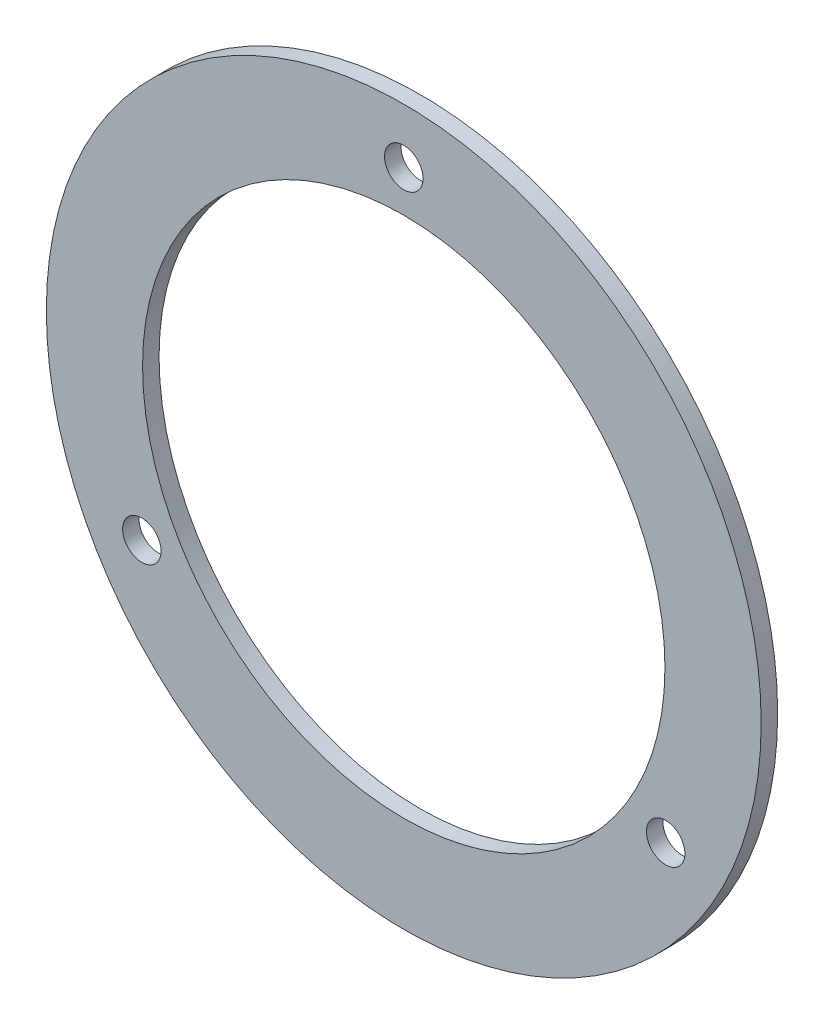
ISO-10303-21;
HEADER;
FILE_DESCRIPTION(('STEP AP214'),'2;1');
FILE_NAME('part.step','',(''),(''),'','','');
FILE_SCHEMA(('AUTOMOTIVE_DESIGN { 1 0 10303 214 1 1 1 1 }'));
ENDSEC;
DATA;
#1=APPLICATION_CONTEXT('core data for automotive mechanical design processes');
#2=APPLICATION_PROTOCOL_DEFINITION('international standard','automotive_design',2000,#1);
#3=PRODUCT_CONTEXT('',#1,'mechanical');
#4=PRODUCT('Part','Part','',(#3));
#5=PRODUCT_RELATED_PRODUCT_CATEGORY('part','',(#4));
#6=PRODUCT_DEFINITION_FORMATION('','',#4);
#7=PRODUCT_DEFINITION_CONTEXT('part definition',#1,'design');
#8=PRODUCT_DEFINITION('design','',#6,#7);
#9=PRODUCT_DEFINITION_SHAPE('','',#8);
#10=(LENGTH_UNIT() NAMED_UNIT(*) SI_UNIT(.MILLI.,.METRE.));
#11=(NAMED_UNIT(*) PLANE_ANGLE_UNIT() SI_UNIT($,.RADIAN.));
#12=(NAMED_UNIT(*) SI_UNIT($,.STERADIAN.) SOLID_ANGLE_UNIT());
#13=UNCERTAINTY_MEASURE_WITH_UNIT(LENGTH_MEASURE(1.E-05),#10,'distance_accuracy_value','');
#14=(GEOMETRIC_REPRESENTATION_CONTEXT(3) GLOBAL_UNCERTAINTY_ASSIGNED_CONTEXT((#13)) GLOBAL_UNIT_ASSIGNED_CONTEXT((#10,
#11,#12)) REPRESENTATION_CONTEXT('',''));
#15=CARTESIAN_POINT('',(0.,0.,0.));
#16=DIRECTION('',(0.,0.,1.));
#17=DIRECTION('',(1.,0.,0.));
#18=AXIS2_PLACEMENT_3D('',#15,#16,#17);
#19=CARTESIAN_POINT('',(0.,0.,3.));
#20=DIRECTION('',(0.,0.,1.));
#21=DIRECTION('',(1.,0.,0.));
#22=AXIS2_PLACEMENT_3D('',#19,#20,#21);
#23=PLANE('',#22);
#24=CARTESIAN_POINT('',(-47.631397208144,-27.5000000000002,3.));
#25=DIRECTION('',(0.,0.,1.));
#26=DIRECTION('',(-0.500000000000004,0.866025403784436,0.));
#27=AXIS2_PLACEMENT_3D('',#24,#25,#26);
#28=CIRCLE('',#27,3.5);
#29=CARTESIAN_POINT('',(-49.381397208144,-24.4689110867547,3.));
#30=VERTEX_POINT('',#29);
#31=EDGE_CURVE('E61',#30,#30,#28,.T.);
#32=ORIENTED_EDGE('',*,*,#31,.F.);
#33=EDGE_LOOP('',(#32));
#34=FACE_BOUND('',#33,.T.);
#35=CARTESIAN_POINT('',(47.6313972081444,-27.4999999999996,3.));
#36=DIRECTION('',(0.,0.,1.));
#37=DIRECTION('',(-0.499999999999992,-0.866025403784443,0.));
#38=AXIS2_PLACEMENT_3D('',#35,#36,#37);
#39=CIRCLE('',#38,3.5);
#40=CARTESIAN_POINT('',(45.8813972081444,-30.5310889132451,3.));
#41=VERTEX_POINT('',#40);
#42=EDGE_CURVE('E55',#41,#41,#39,.T.);
#43=ORIENTED_EDGE('',*,*,#42,.F.);
#44=EDGE_LOOP('',(#43));
#45=FACE_BOUND('',#44,.T.);
#46=CARTESIAN_POINT('',(0.,55.,3.));
#47=DIRECTION('',(0.,0.,1.));
#48=DIRECTION('',(1.,0.,0.));
#49=AXIS2_PLACEMENT_3D('',#46,#47,#48);
#50=CIRCLE('',#49,3.5);
#51=CARTESIAN_POINT('',(3.5,55.,3.));
#52=VERTEX_POINT('',#51);
#53=EDGE_CURVE('E49',#52,#52,#50,.T.);
#54=ORIENTED_EDGE('',*,*,#53,.F.);
#55=EDGE_LOOP('',(#54));
#56=FACE_BOUND('',#55,.T.);
#57=CARTESIAN_POINT('',(0.,0.,3.));
#58=DIRECTION('',(0.,0.,1.));
#59=DIRECTION('',(1.,0.,0.));
#60=AXIS2_PLACEMENT_3D('',#57,#58,#59);
#61=CIRCLE('',#60,65.);
#62=CARTESIAN_POINT('',(65.,0.,3.));
#63=VERTEX_POINT('',#62);
#64=EDGE_CURVE('E10',#63,#63,#61,.T.);
#65=ORIENTED_EDGE('',*,*,#64,.T.);
#66=EDGE_LOOP('',(#65));
#67=FACE_BOUND('',#66,.T.);
#68=CARTESIAN_POINT('',(0.,0.,3.));
#69=DIRECTION('',(0.,0.,1.));
#70=DIRECTION('',(1.,0.,0.));
#71=AXIS2_PLACEMENT_3D('',#68,#69,#70);
#72=CIRCLE('',#71,47.5);
#73=CARTESIAN_POINT('',(47.5,0.,3.));
#74=VERTEX_POINT('',#73);
#75=EDGE_CURVE('E41',#74,#74,#72,.T.);
#76=ORIENTED_EDGE('',*,*,#75,.F.);
#77=EDGE_LOOP('',(#76));
#78=FACE_BOUND('',#77,.T.);
#79=ADVANCED_FACE('F30',(#34,#45,#56,#67,#78),#23,.T.);
#80=CARTESIAN_POINT('',(0.,0.,0.));
#81=DIRECTION('',(0.,0.,1.));
#82=DIRECTION('',(1.,0.,0.));
#83=AXIS2_PLACEMENT_3D('',#80,#81,#82);
#84=PLANE('',#83);
#85=CARTESIAN_POINT('',(-47.631397208144,-27.5000000000002,0.));
#86=DIRECTION('',(0.,0.,1.));
#87=DIRECTION('',(-0.500000000000004,0.866025403784436,0.));
#88=AXIS2_PLACEMENT_3D('',#85,#86,#87);
#89=CIRCLE('',#88,3.5);
#90=CARTESIAN_POINT('',(-49.381397208144,-24.4689110867547,0.));
#91=VERTEX_POINT('',#90);
#92=EDGE_CURVE('E52',#91,#91,#89,.T.);
#93=ORIENTED_EDGE('',*,*,#92,.T.);
#94=EDGE_LOOP('',(#93));
#95=FACE_BOUND('',#94,.T.);
#96=CARTESIAN_POINT('',(47.6313972081444,-27.4999999999996,0.));
#97=DIRECTION('',(0.,0.,1.));
#98=DIRECTION('',(-0.499999999999992,-0.866025403784443,0.));
#99=AXIS2_PLACEMENT_3D('',#96,#97,#98);
#100=CIRCLE('',#99,3.5);
#101=CARTESIAN_POINT('',(45.8813972081444,-30.5310889132451,0.));
#102=VERTEX_POINT('',#101);
#103=EDGE_CURVE('E58',#102,#102,#100,.T.);
#104=ORIENTED_EDGE('',*,*,#103,.T.);
#105=EDGE_LOOP('',(#104));
#106=FACE_BOUND('',#105,.T.);
#107=CARTESIAN_POINT('',(0.,55.,0.));
#108=DIRECTION('',(0.,0.,1.));
#109=DIRECTION('',(1.,0.,0.));
#110=AXIS2_PLACEMENT_3D('',#107,#108,#109);
#111=CIRCLE('',#110,3.5);
#112=CARTESIAN_POINT('',(3.5,55.,0.));
#113=VERTEX_POINT('',#112);
#114=EDGE_CURVE('E46',#113,#113,#111,.T.);
#115=ORIENTED_EDGE('',*,*,#114,.T.);
#116=EDGE_LOOP('',(#115));
#117=FACE_BOUND('',#116,.T.);
#118=CARTESIAN_POINT('',(0.,0.,0.));
#119=DIRECTION('',(0.,0.,1.));
#120=DIRECTION('',(1.,0.,0.));
#121=AXIS2_PLACEMENT_3D('',#118,#119,#120);
#122=CIRCLE('',#121,65.);
#123=CARTESIAN_POINT('',(65.,0.,0.));
#124=VERTEX_POINT('',#123);
#125=EDGE_CURVE('E34',#124,#124,#122,.T.);
#126=ORIENTED_EDGE('',*,*,#125,.F.);
#127=EDGE_LOOP('',(#126));
#128=FACE_BOUND('',#127,.T.);
#129=CARTESIAN_POINT('',(0.,0.,0.));
#130=DIRECTION('',(0.,0.,1.));
#131=DIRECTION('',(1.,0.,0.));
#132=AXIS2_PLACEMENT_3D('',#129,#130,#131);
#133=CIRCLE('',#132,47.5);
#134=CARTESIAN_POINT('',(47.5,0.,0.));
#135=VERTEX_POINT('',#134);
#136=EDGE_CURVE('E43',#135,#135,#133,.T.);
#137=ORIENTED_EDGE('',*,*,#136,.T.);
#138=EDGE_LOOP('',(#137));
#139=FACE_BOUND('',#138,.T.);
#140=ADVANCED_FACE('F67',(#95,#106,#117,#128,#139),#84,.F.);
#141=CARTESIAN_POINT('',(0.,0.,3.));
#142=DIRECTION('',(0.,0.,-1.));
#143=DIRECTION('',(-1.,0.,0.));
#144=AXIS2_PLACEMENT_3D('',#141,#142,#143);
#145=CYLINDRICAL_SURFACE('',#144,65.);
#146=ORIENTED_EDGE('',*,*,#64,.F.);
#147=EDGE_LOOP('',(#146));
#148=FACE_BOUND('',#147,.T.);
#149=ORIENTED_EDGE('',*,*,#125,.T.);
#150=EDGE_LOOP('',(#149));
#151=FACE_BOUND('',#150,.T.);
#152=ADVANCED_FACE('F32',(#148,#151),#145,.T.);
#153=CARTESIAN_POINT('',(0.,0.,3.));
#154=DIRECTION('',(0.,0.,-1.));
#155=DIRECTION('',(-1.,0.,0.));
#156=AXIS2_PLACEMENT_3D('',#153,#154,#155);
#157=CYLINDRICAL_SURFACE('',#156,47.5);
#158=ORIENTED_EDGE('',*,*,#75,.T.);
#159=EDGE_LOOP('',(#158));
#160=FACE_BOUND('',#159,.T.);
#161=ORIENTED_EDGE('',*,*,#136,.F.);
#162=EDGE_LOOP('',(#161));
#163=FACE_BOUND('',#162,.T.);
#164=ADVANCED_FACE('F86',(#160,#163),#157,.F.);
#165=CARTESIAN_POINT('',(0.,55.,0.));
#166=DIRECTION('',(0.,0.,1.));
#167=DIRECTION('',(1.,0.,0.));
#168=AXIS2_PLACEMENT_3D('',#165,#166,#167);
#169=CYLINDRICAL_SURFACE('',#168,3.5);
#170=ORIENTED_EDGE('',*,*,#114,.F.);
#171=EDGE_LOOP('',(#170));
#172=FACE_BOUND('',#171,.T.);
#173=ORIENTED_EDGE('',*,*,#53,.T.);
#174=EDGE_LOOP('',(#173));
#175=FACE_BOUND('',#174,.T.);
#176=ADVANCED_FACE('F89',(#172,#175),#169,.F.);
#177=CARTESIAN_POINT('',(47.6313972081444,-27.4999999999996,0.));
#178=DIRECTION('',(0.,0.,1.));
#179=DIRECTION('',(1.,0.,0.));
#180=AXIS2_PLACEMENT_3D('',#177,#178,#179);
#181=CYLINDRICAL_SURFACE('',#180,3.5);
#182=ORIENTED_EDGE('',*,*,#103,.F.);
#183=EDGE_LOOP('',(#182));
#184=FACE_BOUND('',#183,.T.);
#185=ORIENTED_EDGE('',*,*,#42,.T.);
#186=EDGE_LOOP('',(#185));
#187=FACE_BOUND('',#186,.T.);
#188=ADVANCED_FACE('F73',(#184,#187),#181,.F.);
#189=CARTESIAN_POINT('',(-47.631397208144,-27.5000000000002,0.));
#190=DIRECTION('',(0.,0.,1.));
#191=DIRECTION('',(1.,0.,0.));
#192=AXIS2_PLACEMENT_3D('',#189,#190,#191);
#193=CYLINDRICAL_SURFACE('',#192,3.5);
#194=ORIENTED_EDGE('',*,*,#92,.F.);
#195=EDGE_LOOP('',(#194));
#196=FACE_BOUND('',#195,.T.);
#197=ORIENTED_EDGE('',*,*,#31,.T.);
#198=EDGE_LOOP('',(#197));
#199=FACE_BOUND('',#198,.T.);
#200=ADVANCED_FACE('F70',(#196,#199),#193,.F.);
#201=CLOSED_SHELL('',(#79,#140,#152,#164,#176,#188,#200));
#202=MANIFOLD_SOLID_BREP('B2',#201);
#203=ADVANCED_BREP_SHAPE_REPRESENTATION('',(#18,#202),#14);
#204=SHAPE_DEFINITION_REPRESENTATION(#9,#203);
ENDSEC;
END-ISO-10303-21;
